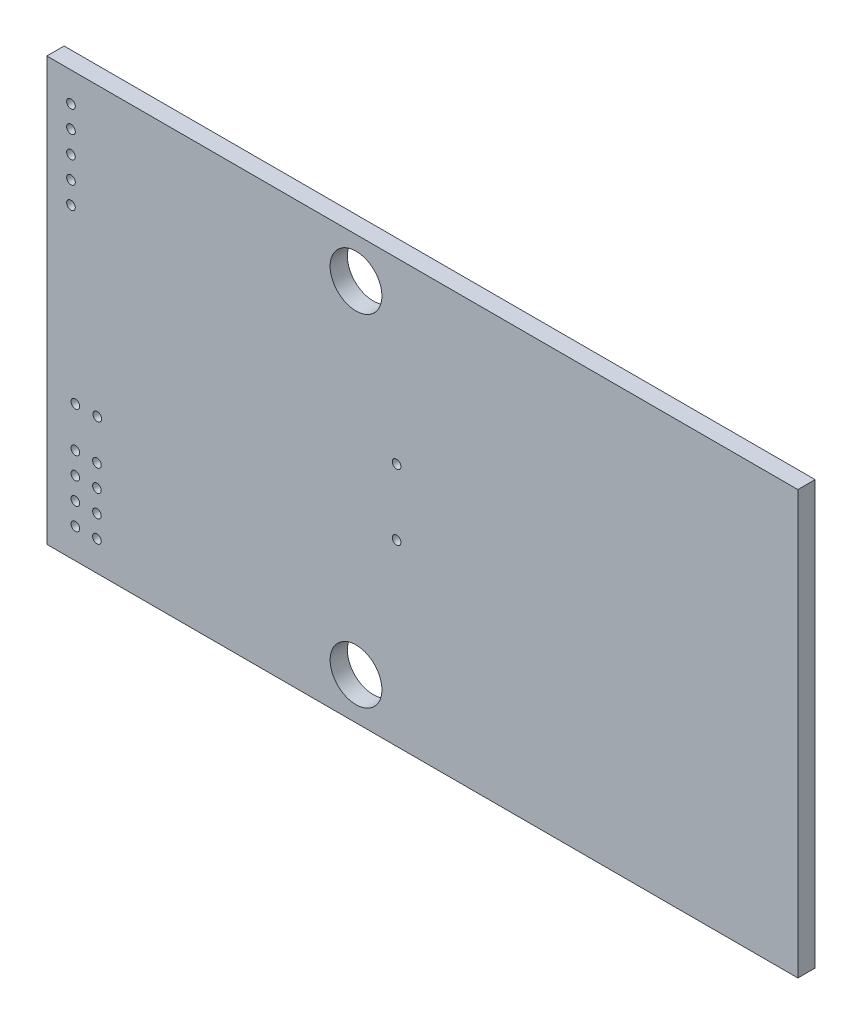
ISO-10303-21;
HEADER;
FILE_DESCRIPTION(('STEP AP214'),'2;1');
FILE_NAME('part.step','',(''),(''),'','','');
FILE_SCHEMA(('AUTOMOTIVE_DESIGN { 1 0 10303 214 1 1 1 1 }'));
ENDSEC;
DATA;
#1=APPLICATION_CONTEXT('core data for automotive mechanical design processes');
#2=APPLICATION_PROTOCOL_DEFINITION('international standard','automotive_design',2000,#1);
#3=PRODUCT_CONTEXT('',#1,'mechanical');
#4=PRODUCT('Part','Part','',(#3));
#5=PRODUCT_RELATED_PRODUCT_CATEGORY('part','',(#4));
#6=PRODUCT_DEFINITION_FORMATION('','',#4);
#7=PRODUCT_DEFINITION_CONTEXT('part definition',#1,'design');
#8=PRODUCT_DEFINITION('design','',#6,#7);
#9=PRODUCT_DEFINITION_SHAPE('','',#8);
#10=(LENGTH_UNIT() NAMED_UNIT(*) SI_UNIT(.MILLI.,.METRE.));
#11=(NAMED_UNIT(*) PLANE_ANGLE_UNIT() SI_UNIT($,.RADIAN.));
#12=(NAMED_UNIT(*) SI_UNIT($,.STERADIAN.) SOLID_ANGLE_UNIT());
#13=UNCERTAINTY_MEASURE_WITH_UNIT(LENGTH_MEASURE(1.E-05),#10,'distance_accuracy_value','');
#14=(GEOMETRIC_REPRESENTATION_CONTEXT(3) GLOBAL_UNCERTAINTY_ASSIGNED_CONTEXT((#13)) GLOBAL_UNIT_ASSIGNED_CONTEXT((#10,
#11,#12)) REPRESENTATION_CONTEXT('',''));
#15=CARTESIAN_POINT('',(0.,0.,0.));
#16=DIRECTION('',(0.,0.,1.));
#17=DIRECTION('',(1.,0.,0.));
#18=AXIS2_PLACEMENT_3D('',#15,#16,#17);
#19=CARTESIAN_POINT('',(0.,0.,0.));
#20=DIRECTION('',(0.,1.,0.));
#21=DIRECTION('',(1.,0.,0.));
#22=AXIS2_PLACEMENT_3D('',#19,#20,#21);
#23=PLANE('',#22);
#24=DIRECTION('',(1.,0.,0.));
#25=VECTOR('',#24,1.);
#26=CARTESIAN_POINT('',(0.,0.,2.0012787));
#27=LINE('',#26,#25);
#28=CARTESIAN_POINT('',(0.,0.,2.0012787));
#29=VERTEX_POINT('',#28);
#30=CARTESIAN_POINT('',(87.,0.,2.0012787));
#31=VERTEX_POINT('',#30);
#32=EDGE_CURVE('E11',#29,#31,#27,.T.);
#33=ORIENTED_EDGE('',*,*,#32,.F.);
#34=DIRECTION('',(0.,0.,1.));
#35=VECTOR('',#34,1.);
#36=CARTESIAN_POINT('',(0.,0.,0.));
#37=LINE('',#36,#35);
#38=CARTESIAN_POINT('',(0.,0.,0.));
#39=VERTEX_POINT('',#38);
#40=EDGE_CURVE('E24',#39,#29,#37,.T.);
#41=ORIENTED_EDGE('',*,*,#40,.F.);
#42=DIRECTION('',(1.,0.,0.));
#43=VECTOR('',#42,1.);
#44=CARTESIAN_POINT('',(0.,0.,0.));
#45=LINE('',#44,#43);
#46=CARTESIAN_POINT('',(87.,0.,0.));
#47=VERTEX_POINT('',#46);
#48=EDGE_CURVE('E348',#39,#47,#45,.T.);
#49=ORIENTED_EDGE('',*,*,#48,.T.);
#50=DIRECTION('',(0.,0.,1.));
#51=VECTOR('',#50,1.);
#52=CARTESIAN_POINT('',(87.,0.,0.));
#53=LINE('',#52,#51);
#54=EDGE_CURVE('E37',#47,#31,#53,.T.);
#55=ORIENTED_EDGE('',*,*,#54,.T.);
#56=EDGE_LOOP('',(#33,#41,#49,#55));
#57=FACE_BOUND('',#56,.T.);
#58=ADVANCED_FACE('F17',(#57),#23,.F.);
#59=CARTESIAN_POINT('',(87.,0.,0.));
#60=DIRECTION('',(-1.,0.,0.));
#61=DIRECTION('',(0.,1.,0.));
#62=AXIS2_PLACEMENT_3D('',#59,#60,#61);
#63=PLANE('',#62);
#64=DIRECTION('',(0.,1.,0.));
#65=VECTOR('',#64,1.);
#66=CARTESIAN_POINT('',(87.,0.,2.0012787));
#67=LINE('',#66,#65);
#68=CARTESIAN_POINT('',(87.,49.,2.0012787));
#69=VERTEX_POINT('',#68);
#70=EDGE_CURVE('E344',#31,#69,#67,.T.);
#71=ORIENTED_EDGE('',*,*,#70,.F.);
#72=ORIENTED_EDGE('',*,*,#54,.F.);
#73=DIRECTION('',(0.,1.,0.));
#74=VECTOR('',#73,1.);
#75=CARTESIAN_POINT('',(87.,0.,0.));
#76=LINE('',#75,#74);
#77=CARTESIAN_POINT('',(87.,49.,0.));
#78=VERTEX_POINT('',#77);
#79=EDGE_CURVE('E341',#47,#78,#76,.T.);
#80=ORIENTED_EDGE('',*,*,#79,.T.);
#81=DIRECTION('',(0.,0.,1.));
#82=VECTOR('',#81,1.);
#83=CARTESIAN_POINT('',(87.,49.,0.));
#84=LINE('',#83,#82);
#85=EDGE_CURVE('E339',#78,#69,#84,.T.);
#86=ORIENTED_EDGE('',*,*,#85,.T.);
#87=EDGE_LOOP('',(#71,#72,#80,#86));
#88=FACE_BOUND('',#87,.T.);
#89=ADVANCED_FACE('F357',(#88),#63,.F.);
#90=CARTESIAN_POINT('',(87.,49.,0.));
#91=DIRECTION('',(0.,-1.,0.));
#92=DIRECTION('',(-1.,0.,0.));
#93=AXIS2_PLACEMENT_3D('',#90,#91,#92);
#94=PLANE('',#93);
#95=DIRECTION('',(-1.,0.,0.));
#96=VECTOR('',#95,1.);
#97=CARTESIAN_POINT('',(87.,49.,2.0012787));
#98=LINE('',#97,#96);
#99=CARTESIAN_POINT('',(0.,49.,2.0012787));
#100=VERTEX_POINT('',#99);
#101=EDGE_CURVE('E336',#69,#100,#98,.T.);
#102=ORIENTED_EDGE('',*,*,#101,.F.);
#103=ORIENTED_EDGE('',*,*,#85,.F.);
#104=DIRECTION('',(-1.,0.,0.));
#105=VECTOR('',#104,1.);
#106=CARTESIAN_POINT('',(87.,49.,0.));
#107=LINE('',#106,#105);
#108=CARTESIAN_POINT('',(0.,49.,0.));
#109=VERTEX_POINT('',#108);
#110=EDGE_CURVE('E333',#78,#109,#107,.T.);
#111=ORIENTED_EDGE('',*,*,#110,.T.);
#112=DIRECTION('',(0.,0.,1.));
#113=VECTOR('',#112,1.);
#114=CARTESIAN_POINT('',(0.,49.,0.));
#115=LINE('',#114,#113);
#116=EDGE_CURVE('E331',#109,#100,#115,.T.);
#117=ORIENTED_EDGE('',*,*,#116,.T.);
#118=EDGE_LOOP('',(#102,#103,#111,#117));
#119=FACE_BOUND('',#118,.T.);
#120=ADVANCED_FACE('F363',(#119),#94,.F.);
#121=CARTESIAN_POINT('',(0.,49.,0.));
#122=DIRECTION('',(1.,0.,0.));
#123=DIRECTION('',(0.,-1.,0.));
#124=AXIS2_PLACEMENT_3D('',#121,#122,#123);
#125=PLANE('',#124);
#126=DIRECTION('',(0.,-1.,0.));
#127=VECTOR('',#126,1.);
#128=CARTESIAN_POINT('',(0.,49.,2.0012787));
#129=LINE('',#128,#127);
#130=EDGE_CURVE('E328',#100,#29,#129,.T.);
#131=ORIENTED_EDGE('',*,*,#130,.F.);
#132=ORIENTED_EDGE('',*,*,#116,.F.);
#133=DIRECTION('',(0.,-1.,0.));
#134=VECTOR('',#133,1.);
#135=CARTESIAN_POINT('',(0.,49.,0.));
#136=LINE('',#135,#134);
#137=EDGE_CURVE('E326',#109,#39,#136,.T.);
#138=ORIENTED_EDGE('',*,*,#137,.T.);
#139=ORIENTED_EDGE('',*,*,#40,.T.);
#140=EDGE_LOOP('',(#131,#132,#138,#139));
#141=FACE_BOUND('',#140,.T.);
#142=ADVANCED_FACE('F364',(#141),#125,.F.);
#143=CARTESIAN_POINT('',(3.302,11.08600018,0.));
#144=DIRECTION('',(0.,0.,-1.));
#145=DIRECTION('',(1.,0.,0.));
#146=AXIS2_PLACEMENT_3D('',#143,#144,#145);
#147=CYLINDRICAL_SURFACE('',#146,0.499999);
#148=DIRECTION('',(0.,0.,1.));
#149=VECTOR('',#148,1.);
#150=CARTESIAN_POINT('',(3.801999,11.08600018,0.));
#151=LINE('',#150,#149);
#152=CARTESIAN_POINT('',(3.801999,11.08600018,0.));
#153=VERTEX_POINT('',#152);
#154=CARTESIAN_POINT('',(3.801999,11.08600018,2.0012787));
#155=VERTEX_POINT('',#154);
#156=EDGE_CURVE('E324',#153,#155,#151,.T.);
#157=ORIENTED_EDGE('',*,*,#156,.T.);
#158=CARTESIAN_POINT('',(3.302,11.08600018,2.0012787));
#159=DIRECTION('',(0.,0.,1.));
#160=DIRECTION('',(1.,0.,0.));
#161=AXIS2_PLACEMENT_3D('',#158,#159,#160);
#162=CIRCLE('',#161,0.499999);
#163=EDGE_CURVE('E321',#155,#155,#162,.T.);
#164=ORIENTED_EDGE('',*,*,#163,.T.);
#165=ORIENTED_EDGE('',*,*,#156,.F.);
#166=CARTESIAN_POINT('',(3.302,11.08600018,0.));
#167=DIRECTION('',(0.,0.,1.));
#168=DIRECTION('',(1.,0.,0.));
#169=AXIS2_PLACEMENT_3D('',#166,#167,#168);
#170=CIRCLE('',#169,0.499999);
#171=EDGE_CURVE('E318',#153,#153,#170,.T.);
#172=ORIENTED_EDGE('',*,*,#171,.F.);
#173=EDGE_LOOP('',(#157,#164,#165,#172));
#174=FACE_BOUND('',#173,.T.);
#175=ADVANCED_FACE('F366',(#174),#147,.F.);
#176=CARTESIAN_POINT('',(3.302,15.748,0.));
#177=DIRECTION('',(0.,0.,-1.));
#178=DIRECTION('',(1.,0.,0.));
#179=AXIS2_PLACEMENT_3D('',#176,#177,#178);
#180=CYLINDRICAL_SURFACE('',#179,0.499999);
#181=DIRECTION('',(0.,0.,1.));
#182=VECTOR('',#181,1.);
#183=CARTESIAN_POINT('',(3.801999,15.748,0.));
#184=LINE('',#183,#182);
#185=CARTESIAN_POINT('',(3.801999,15.748,0.));
#186=VERTEX_POINT('',#185);
#187=CARTESIAN_POINT('',(3.801999,15.748,2.0012787));
#188=VERTEX_POINT('',#187);
#189=EDGE_CURVE('E316',#186,#188,#184,.T.);
#190=ORIENTED_EDGE('',*,*,#189,.T.);
#191=CARTESIAN_POINT('',(3.302,15.748,2.0012787));
#192=DIRECTION('',(0.,0.,1.));
#193=DIRECTION('',(1.,0.,0.));
#194=AXIS2_PLACEMENT_3D('',#191,#192,#193);
#195=CIRCLE('',#194,0.499999);
#196=EDGE_CURVE('E313',#188,#188,#195,.T.);
#197=ORIENTED_EDGE('',*,*,#196,.T.);
#198=ORIENTED_EDGE('',*,*,#189,.F.);
#199=CARTESIAN_POINT('',(3.302,15.748,0.));
#200=DIRECTION('',(0.,0.,1.));
#201=DIRECTION('',(1.,0.,0.));
#202=AXIS2_PLACEMENT_3D('',#199,#200,#201);
#203=CIRCLE('',#202,0.499999);
#204=EDGE_CURVE('E310',#186,#186,#203,.T.);
#205=ORIENTED_EDGE('',*,*,#204,.F.);
#206=EDGE_LOOP('',(#190,#197,#198,#205));
#207=FACE_BOUND('',#206,.T.);
#208=ADVANCED_FACE('F373',(#207),#180,.F.);
#209=CARTESIAN_POINT('',(3.302,3.46600018,0.));
#210=DIRECTION('',(0.,0.,-1.));
#211=DIRECTION('',(1.,0.,0.));
#212=AXIS2_PLACEMENT_3D('',#209,#210,#211);
#213=CYLINDRICAL_SURFACE('',#212,0.499999);
#214=DIRECTION('',(0.,0.,1.));
#215=VECTOR('',#214,1.);
#216=CARTESIAN_POINT('',(3.801999,3.46600018,0.));
#217=LINE('',#216,#215);
#218=CARTESIAN_POINT('',(3.801999,3.46600018,0.));
#219=VERTEX_POINT('',#218);
#220=CARTESIAN_POINT('',(3.801999,3.46600018,2.0012787));
#221=VERTEX_POINT('',#220);
#222=EDGE_CURVE('E308',#219,#221,#217,.T.);
#223=ORIENTED_EDGE('',*,*,#222,.T.);
#224=CARTESIAN_POINT('',(3.302,3.46600018,2.0012787));
#225=DIRECTION('',(0.,0.,1.));
#226=DIRECTION('',(1.,0.,0.));
#227=AXIS2_PLACEMENT_3D('',#224,#225,#226);
#228=CIRCLE('',#227,0.499999);
#229=EDGE_CURVE('E305',#221,#221,#228,.T.);
#230=ORIENTED_EDGE('',*,*,#229,.T.);
#231=ORIENTED_EDGE('',*,*,#222,.F.);
#232=CARTESIAN_POINT('',(3.302,3.46600018,0.));
#233=DIRECTION('',(0.,0.,1.));
#234=DIRECTION('',(1.,0.,0.));
#235=AXIS2_PLACEMENT_3D('',#232,#233,#234);
#236=CIRCLE('',#235,0.499999);
#237=EDGE_CURVE('E302',#219,#219,#236,.T.);
#238=ORIENTED_EDGE('',*,*,#237,.F.);
#239=EDGE_LOOP('',(#223,#230,#231,#238));
#240=FACE_BOUND('',#239,.T.);
#241=ADVANCED_FACE('F414',(#240),#213,.F.);
#242=CARTESIAN_POINT('',(3.302,8.54600018,0.));
#243=DIRECTION('',(0.,0.,-1.));
#244=DIRECTION('',(1.,0.,0.));
#245=AXIS2_PLACEMENT_3D('',#242,#243,#244);
#246=CYLINDRICAL_SURFACE('',#245,0.499999);
#247=DIRECTION('',(0.,0.,1.));
#248=VECTOR('',#247,1.);
#249=CARTESIAN_POINT('',(3.801999,8.54600018,0.));
#250=LINE('',#249,#248);
#251=CARTESIAN_POINT('',(3.801999,8.54600018,0.));
#252=VERTEX_POINT('',#251);
#253=CARTESIAN_POINT('',(3.801999,8.54600018,2.0012787));
#254=VERTEX_POINT('',#253);
#255=EDGE_CURVE('E300',#252,#254,#250,.T.);
#256=ORIENTED_EDGE('',*,*,#255,.T.);
#257=CARTESIAN_POINT('',(3.302,8.54600018,2.0012787));
#258=DIRECTION('',(0.,0.,1.));
#259=DIRECTION('',(1.,0.,0.));
#260=AXIS2_PLACEMENT_3D('',#257,#258,#259);
#261=CIRCLE('',#260,0.499999);
#262=EDGE_CURVE('E297',#254,#254,#261,.T.);
#263=ORIENTED_EDGE('',*,*,#262,.T.);
#264=ORIENTED_EDGE('',*,*,#255,.F.);
#265=CARTESIAN_POINT('',(3.302,8.54600018,0.));
#266=DIRECTION('',(0.,0.,1.));
#267=DIRECTION('',(1.,0.,0.));
#268=AXIS2_PLACEMENT_3D('',#265,#266,#267);
#269=CIRCLE('',#268,0.499999);
#270=EDGE_CURVE('E294',#252,#252,#269,.T.);
#271=ORIENTED_EDGE('',*,*,#270,.F.);
#272=EDGE_LOOP('',(#256,#263,#264,#271));
#273=FACE_BOUND('',#272,.T.);
#274=ADVANCED_FACE('F424',(#273),#246,.F.);
#275=CARTESIAN_POINT('',(2.794,43.053,0.));
#276=DIRECTION('',(0.,0.,-1.));
#277=DIRECTION('',(1.,0.,0.));
#278=AXIS2_PLACEMENT_3D('',#275,#276,#277);
#279=CYLINDRICAL_SURFACE('',#278,0.499999);
#280=DIRECTION('',(0.,0.,1.));
#281=VECTOR('',#280,1.);
#282=CARTESIAN_POINT('',(3.293999,43.053,0.));
#283=LINE('',#282,#281);
#284=CARTESIAN_POINT('',(3.293999,43.053,0.));
#285=VERTEX_POINT('',#284);
#286=CARTESIAN_POINT('',(3.293999,43.053,2.0012787));
#287=VERTEX_POINT('',#286);
#288=EDGE_CURVE('E292',#285,#287,#283,.T.);
#289=ORIENTED_EDGE('',*,*,#288,.T.);
#290=CARTESIAN_POINT('',(2.794,43.053,2.0012787));
#291=DIRECTION('',(0.,0.,1.));
#292=DIRECTION('',(1.,0.,0.));
#293=AXIS2_PLACEMENT_3D('',#290,#291,#292);
#294=CIRCLE('',#293,0.499999);
#295=EDGE_CURVE('E289',#287,#287,#294,.T.);
#296=ORIENTED_EDGE('',*,*,#295,.T.);
#297=ORIENTED_EDGE('',*,*,#288,.F.);
#298=CARTESIAN_POINT('',(2.794,43.053,0.));
#299=DIRECTION('',(0.,0.,1.));
#300=DIRECTION('',(1.,0.,0.));
#301=AXIS2_PLACEMENT_3D('',#298,#299,#300);
#302=CIRCLE('',#301,0.499999);
#303=EDGE_CURVE('E286',#285,#285,#302,.T.);
#304=ORIENTED_EDGE('',*,*,#303,.F.);
#305=EDGE_LOOP('',(#289,#296,#297,#304));
#306=FACE_BOUND('',#305,.T.);
#307=ADVANCED_FACE('F434',(#306),#279,.F.);
#308=CARTESIAN_POINT('',(2.794,45.593,0.));
#309=DIRECTION('',(0.,0.,-1.));
#310=DIRECTION('',(1.,0.,0.));
#311=AXIS2_PLACEMENT_3D('',#308,#309,#310);
#312=CYLINDRICAL_SURFACE('',#311,0.499999);
#313=DIRECTION('',(0.,0.,1.));
#314=VECTOR('',#313,1.);
#315=CARTESIAN_POINT('',(3.293999,45.593,0.));
#316=LINE('',#315,#314);
#317=CARTESIAN_POINT('',(3.293999,45.593,0.));
#318=VERTEX_POINT('',#317);
#319=CARTESIAN_POINT('',(3.293999,45.593,2.0012787));
#320=VERTEX_POINT('',#319);
#321=EDGE_CURVE('E284',#318,#320,#316,.T.);
#322=ORIENTED_EDGE('',*,*,#321,.T.);
#323=CARTESIAN_POINT('',(2.794,45.593,2.0012787));
#324=DIRECTION('',(0.,0.,1.));
#325=DIRECTION('',(1.,0.,0.));
#326=AXIS2_PLACEMENT_3D('',#323,#324,#325);
#327=CIRCLE('',#326,0.499999);
#328=EDGE_CURVE('E281',#320,#320,#327,.T.);
#329=ORIENTED_EDGE('',*,*,#328,.T.);
#330=ORIENTED_EDGE('',*,*,#321,.F.);
#331=CARTESIAN_POINT('',(2.794,45.593,0.));
#332=DIRECTION('',(0.,0.,1.));
#333=DIRECTION('',(1.,0.,0.));
#334=AXIS2_PLACEMENT_3D('',#331,#332,#333);
#335=CIRCLE('',#334,0.499999);
#336=EDGE_CURVE('E278',#318,#318,#335,.T.);
#337=ORIENTED_EDGE('',*,*,#336,.F.);
#338=EDGE_LOOP('',(#322,#329,#330,#337));
#339=FACE_BOUND('',#338,.T.);
#340=ADVANCED_FACE('F444',(#339),#312,.F.);
#341=CARTESIAN_POINT('',(2.794,35.433,0.));
#342=DIRECTION('',(0.,0.,-1.));
#343=DIRECTION('',(1.,0.,0.));
#344=AXIS2_PLACEMENT_3D('',#341,#342,#343);
#345=CYLINDRICAL_SURFACE('',#344,0.499999);
#346=DIRECTION('',(0.,0.,1.));
#347=VECTOR('',#346,1.);
#348=CARTESIAN_POINT('',(3.293999,35.433,0.));
#349=LINE('',#348,#347);
#350=CARTESIAN_POINT('',(3.293999,35.433,0.));
#351=VERTEX_POINT('',#350);
#352=CARTESIAN_POINT('',(3.293999,35.433,2.0012787));
#353=VERTEX_POINT('',#352);
#354=EDGE_CURVE('E276',#351,#353,#349,.T.);
#355=ORIENTED_EDGE('',*,*,#354,.T.);
#356=CARTESIAN_POINT('',(2.794,35.433,2.0012787));
#357=DIRECTION('',(0.,0.,1.));
#358=DIRECTION('',(1.,0.,0.));
#359=AXIS2_PLACEMENT_3D('',#356,#357,#358);
#360=CIRCLE('',#359,0.499999);
#361=EDGE_CURVE('E273',#353,#353,#360,.T.);
#362=ORIENTED_EDGE('',*,*,#361,.T.);
#363=ORIENTED_EDGE('',*,*,#354,.F.);
#364=CARTESIAN_POINT('',(2.794,35.433,0.));
#365=DIRECTION('',(0.,0.,1.));
#366=DIRECTION('',(1.,0.,0.));
#367=AXIS2_PLACEMENT_3D('',#364,#365,#366);
#368=CIRCLE('',#367,0.499999);
#369=EDGE_CURVE('E270',#351,#351,#368,.T.);
#370=ORIENTED_EDGE('',*,*,#369,.F.);
#371=EDGE_LOOP('',(#355,#362,#363,#370));
#372=FACE_BOUND('',#371,.T.);
#373=ADVANCED_FACE('F454',(#372),#345,.F.);
#374=CARTESIAN_POINT('',(2.794,40.513,0.));
#375=DIRECTION('',(0.,0.,-1.));
#376=DIRECTION('',(1.,0.,0.));
#377=AXIS2_PLACEMENT_3D('',#374,#375,#376);
#378=CYLINDRICAL_SURFACE('',#377,0.499999);
#379=DIRECTION('',(0.,0.,1.));
#380=VECTOR('',#379,1.);
#381=CARTESIAN_POINT('',(3.293999,40.513,0.));
#382=LINE('',#381,#380);
#383=CARTESIAN_POINT('',(3.293999,40.513,0.));
#384=VERTEX_POINT('',#383);
#385=CARTESIAN_POINT('',(3.293999,40.513,2.0012787));
#386=VERTEX_POINT('',#385);
#387=EDGE_CURVE('E268',#384,#386,#382,.T.);
#388=ORIENTED_EDGE('',*,*,#387,.T.);
#389=CARTESIAN_POINT('',(2.794,40.513,2.0012787));
#390=DIRECTION('',(0.,0.,1.));
#391=DIRECTION('',(1.,0.,0.));
#392=AXIS2_PLACEMENT_3D('',#389,#390,#391);
#393=CIRCLE('',#392,0.499999);
#394=EDGE_CURVE('E265',#386,#386,#393,.T.);
#395=ORIENTED_EDGE('',*,*,#394,.T.);
#396=ORIENTED_EDGE('',*,*,#387,.F.);
#397=CARTESIAN_POINT('',(2.794,40.513,0.));
#398=DIRECTION('',(0.,0.,1.));
#399=DIRECTION('',(1.,0.,0.));
#400=AXIS2_PLACEMENT_3D('',#397,#398,#399);
#401=CIRCLE('',#400,0.499999);
#402=EDGE_CURVE('E262',#384,#384,#401,.T.);
#403=ORIENTED_EDGE('',*,*,#402,.F.);
#404=EDGE_LOOP('',(#388,#395,#396,#403));
#405=FACE_BOUND('',#404,.T.);
#406=ADVANCED_FACE('F464',(#405),#378,.F.);
#407=CARTESIAN_POINT('',(2.794,37.973,0.));
#408=DIRECTION('',(0.,0.,-1.));
#409=DIRECTION('',(1.,0.,0.));
#410=AXIS2_PLACEMENT_3D('',#407,#408,#409);
#411=CYLINDRICAL_SURFACE('',#410,0.499999);
#412=DIRECTION('',(0.,0.,1.));
#413=VECTOR('',#412,1.);
#414=CARTESIAN_POINT('',(3.293999,37.973,0.));
#415=LINE('',#414,#413);
#416=CARTESIAN_POINT('',(3.293999,37.973,0.));
#417=VERTEX_POINT('',#416);
#418=CARTESIAN_POINT('',(3.293999,37.973,2.0012787));
#419=VERTEX_POINT('',#418);
#420=EDGE_CURVE('E260',#417,#419,#415,.T.);
#421=ORIENTED_EDGE('',*,*,#420,.T.);
#422=CARTESIAN_POINT('',(2.794,37.973,2.0012787));
#423=DIRECTION('',(0.,0.,1.));
#424=DIRECTION('',(1.,0.,0.));
#425=AXIS2_PLACEMENT_3D('',#422,#423,#424);
#426=CIRCLE('',#425,0.499999);
#427=EDGE_CURVE('E257',#419,#419,#426,.T.);
#428=ORIENTED_EDGE('',*,*,#427,.T.);
#429=ORIENTED_EDGE('',*,*,#420,.F.);
#430=CARTESIAN_POINT('',(2.794,37.973,0.));
#431=DIRECTION('',(0.,0.,1.));
#432=DIRECTION('',(1.,0.,0.));
#433=AXIS2_PLACEMENT_3D('',#430,#431,#432);
#434=CIRCLE('',#433,0.499999);
#435=EDGE_CURVE('E254',#417,#417,#434,.T.);
#436=ORIENTED_EDGE('',*,*,#435,.F.);
#437=EDGE_LOOP('',(#421,#428,#429,#436));
#438=FACE_BOUND('',#437,.T.);
#439=ADVANCED_FACE('F474',(#438),#411,.F.);
#440=CARTESIAN_POINT('',(5.80200008,3.46600018,0.));
#441=DIRECTION('',(0.,0.,-1.));
#442=DIRECTION('',(1.,0.,0.));
#443=AXIS2_PLACEMENT_3D('',#440,#441,#442);
#444=CYLINDRICAL_SURFACE('',#443,0.499999);
#445=DIRECTION('',(0.,0.,1.));
#446=VECTOR('',#445,1.);
#447=CARTESIAN_POINT('',(6.30199908,3.46600018,0.));
#448=LINE('',#447,#446);
#449=CARTESIAN_POINT('',(6.30199908,3.46600018,0.));
#450=VERTEX_POINT('',#449);
#451=CARTESIAN_POINT('',(6.30199908,3.46600018,2.0012787));
#452=VERTEX_POINT('',#451);
#453=EDGE_CURVE('E252',#450,#452,#448,.T.);
#454=ORIENTED_EDGE('',*,*,#453,.T.);
#455=CARTESIAN_POINT('',(5.80200008,3.46600018,2.0012787));
#456=DIRECTION('',(0.,0.,1.));
#457=DIRECTION('',(1.,0.,0.));
#458=AXIS2_PLACEMENT_3D('',#455,#456,#457);
#459=CIRCLE('',#458,0.499999);
#460=EDGE_CURVE('E249',#452,#452,#459,.T.);
#461=ORIENTED_EDGE('',*,*,#460,.T.);
#462=ORIENTED_EDGE('',*,*,#453,.F.);
#463=CARTESIAN_POINT('',(5.80200008,3.46600018,0.));
#464=DIRECTION('',(0.,0.,1.));
#465=DIRECTION('',(1.,0.,0.));
#466=AXIS2_PLACEMENT_3D('',#463,#464,#465);
#467=CIRCLE('',#466,0.499999);
#468=EDGE_CURVE('E246',#450,#450,#467,.T.);
#469=ORIENTED_EDGE('',*,*,#468,.F.);
#470=EDGE_LOOP('',(#454,#461,#462,#469));
#471=FACE_BOUND('',#470,.T.);
#472=ADVANCED_FACE('F484',(#471),#444,.F.);
#473=CARTESIAN_POINT('',(3.302,6.00600018,0.));
#474=DIRECTION('',(0.,0.,-1.));
#475=DIRECTION('',(1.,0.,0.));
#476=AXIS2_PLACEMENT_3D('',#473,#474,#475);
#477=CYLINDRICAL_SURFACE('',#476,0.499999);
#478=DIRECTION('',(0.,0.,1.));
#479=VECTOR('',#478,1.);
#480=CARTESIAN_POINT('',(3.801999,6.00600018,0.));
#481=LINE('',#480,#479);
#482=CARTESIAN_POINT('',(3.801999,6.00600018,0.));
#483=VERTEX_POINT('',#482);
#484=CARTESIAN_POINT('',(3.801999,6.00600018,2.0012787));
#485=VERTEX_POINT('',#484);
#486=EDGE_CURVE('E244',#483,#485,#481,.T.);
#487=ORIENTED_EDGE('',*,*,#486,.T.);
#488=CARTESIAN_POINT('',(3.302,6.00600018,2.0012787));
#489=DIRECTION('',(0.,0.,1.));
#490=DIRECTION('',(1.,0.,0.));
#491=AXIS2_PLACEMENT_3D('',#488,#489,#490);
#492=CIRCLE('',#491,0.499999);
#493=EDGE_CURVE('E241',#485,#485,#492,.T.);
#494=ORIENTED_EDGE('',*,*,#493,.T.);
#495=ORIENTED_EDGE('',*,*,#486,.F.);
#496=CARTESIAN_POINT('',(3.302,6.00600018,0.));
#497=DIRECTION('',(0.,0.,1.));
#498=DIRECTION('',(1.,0.,0.));
#499=AXIS2_PLACEMENT_3D('',#496,#497,#498);
#500=CIRCLE('',#499,0.499999);
#501=EDGE_CURVE('E238',#483,#483,#500,.T.);
#502=ORIENTED_EDGE('',*,*,#501,.F.);
#503=EDGE_LOOP('',(#487,#494,#495,#502));
#504=FACE_BOUND('',#503,.T.);
#505=ADVANCED_FACE('F494',(#504),#477,.F.);
#506=CARTESIAN_POINT('',(5.80200008,6.00600018,0.));
#507=DIRECTION('',(0.,0.,-1.));
#508=DIRECTION('',(1.,0.,0.));
#509=AXIS2_PLACEMENT_3D('',#506,#507,#508);
#510=CYLINDRICAL_SURFACE('',#509,0.499999);
#511=DIRECTION('',(0.,0.,1.));
#512=VECTOR('',#511,1.);
#513=CARTESIAN_POINT('',(6.30199908,6.00600018,0.));
#514=LINE('',#513,#512);
#515=CARTESIAN_POINT('',(6.30199908,6.00600018,0.));
#516=VERTEX_POINT('',#515);
#517=CARTESIAN_POINT('',(6.30199908,6.00600018,2.0012787));
#518=VERTEX_POINT('',#517);
#519=EDGE_CURVE('E236',#516,#518,#514,.T.);
#520=ORIENTED_EDGE('',*,*,#519,.T.);
#521=CARTESIAN_POINT('',(5.80200008,6.00600018,2.0012787));
#522=DIRECTION('',(0.,0.,1.));
#523=DIRECTION('',(1.,0.,0.));
#524=AXIS2_PLACEMENT_3D('',#521,#522,#523);
#525=CIRCLE('',#524,0.499999);
#526=EDGE_CURVE('E233',#518,#518,#525,.T.);
#527=ORIENTED_EDGE('',*,*,#526,.T.);
#528=ORIENTED_EDGE('',*,*,#519,.F.);
#529=CARTESIAN_POINT('',(5.80200008,6.00600018,0.));
#530=DIRECTION('',(0.,0.,1.));
#531=DIRECTION('',(1.,0.,0.));
#532=AXIS2_PLACEMENT_3D('',#529,#530,#531);
#533=CIRCLE('',#532,0.499999);
#534=EDGE_CURVE('E230',#516,#516,#533,.T.);
#535=ORIENTED_EDGE('',*,*,#534,.F.);
#536=EDGE_LOOP('',(#520,#527,#528,#535));
#537=FACE_BOUND('',#536,.T.);
#538=ADVANCED_FACE('F504',(#537),#510,.F.);
#539=CARTESIAN_POINT('',(5.80200008,8.54600018,0.));
#540=DIRECTION('',(0.,0.,-1.));
#541=DIRECTION('',(1.,0.,0.));
#542=AXIS2_PLACEMENT_3D('',#539,#540,#541);
#543=CYLINDRICAL_SURFACE('',#542,0.499999);
#544=DIRECTION('',(0.,0.,1.));
#545=VECTOR('',#544,1.);
#546=CARTESIAN_POINT('',(6.30199908,8.54600018,0.));
#547=LINE('',#546,#545);
#548=CARTESIAN_POINT('',(6.30199908,8.54600018,0.));
#549=VERTEX_POINT('',#548);
#550=CARTESIAN_POINT('',(6.30199908,8.54600018,2.0012787));
#551=VERTEX_POINT('',#550);
#552=EDGE_CURVE('E228',#549,#551,#547,.T.);
#553=ORIENTED_EDGE('',*,*,#552,.T.);
#554=CARTESIAN_POINT('',(5.80200008,8.54600018,2.0012787));
#555=DIRECTION('',(0.,0.,1.));
#556=DIRECTION('',(1.,0.,0.));
#557=AXIS2_PLACEMENT_3D('',#554,#555,#556);
#558=CIRCLE('',#557,0.499999);
#559=EDGE_CURVE('E225',#551,#551,#558,.T.);
#560=ORIENTED_EDGE('',*,*,#559,.T.);
#561=ORIENTED_EDGE('',*,*,#552,.F.);
#562=CARTESIAN_POINT('',(5.80200008,8.54600018,0.));
#563=DIRECTION('',(0.,0.,1.));
#564=DIRECTION('',(1.,0.,0.));
#565=AXIS2_PLACEMENT_3D('',#562,#563,#564);
#566=CIRCLE('',#565,0.499999);
#567=EDGE_CURVE('E222',#549,#549,#566,.T.);
#568=ORIENTED_EDGE('',*,*,#567,.F.);
#569=EDGE_LOOP('',(#553,#560,#561,#568));
#570=FACE_BOUND('',#569,.T.);
#571=ADVANCED_FACE('F514',(#570),#543,.F.);
#572=CARTESIAN_POINT('',(35.814,4.826,0.));
#573=DIRECTION('',(0.,0.,-1.));
#574=DIRECTION('',(1.,0.,0.));
#575=AXIS2_PLACEMENT_3D('',#572,#573,#574);
#576=CYLINDRICAL_SURFACE('',#575,2.99999908);
#577=DIRECTION('',(0.,0.,1.));
#578=VECTOR('',#577,1.);
#579=CARTESIAN_POINT('',(38.81399908,4.826,0.));
#580=LINE('',#579,#578);
#581=CARTESIAN_POINT('',(38.81399908,4.826,0.));
#582=VERTEX_POINT('',#581);
#583=CARTESIAN_POINT('',(38.81399908,4.826,2.0012787));
#584=VERTEX_POINT('',#583);
#585=EDGE_CURVE('E220',#582,#584,#580,.T.);
#586=ORIENTED_EDGE('',*,*,#585,.T.);
#587=CARTESIAN_POINT('',(35.814,4.826,2.0012787));
#588=DIRECTION('',(0.,0.,1.));
#589=DIRECTION('',(1.,0.,0.));
#590=AXIS2_PLACEMENT_3D('',#587,#588,#589);
#591=CIRCLE('',#590,2.99999908);
#592=EDGE_CURVE('E217',#584,#584,#591,.T.);
#593=ORIENTED_EDGE('',*,*,#592,.T.);
#594=ORIENTED_EDGE('',*,*,#585,.F.);
#595=CARTESIAN_POINT('',(35.814,4.826,0.));
#596=DIRECTION('',(0.,0.,1.));
#597=DIRECTION('',(1.,0.,0.));
#598=AXIS2_PLACEMENT_3D('',#595,#596,#597);
#599=CIRCLE('',#598,2.99999908);
#600=EDGE_CURVE('E214',#582,#582,#599,.T.);
#601=ORIENTED_EDGE('',*,*,#600,.F.);
#602=EDGE_LOOP('',(#586,#593,#594,#601));
#603=FACE_BOUND('',#602,.T.);
#604=ADVANCED_FACE('F524',(#603),#576,.F.);
#605=CARTESIAN_POINT('',(5.80200008,11.08600018,0.));
#606=DIRECTION('',(0.,0.,-1.));
#607=DIRECTION('',(1.,0.,0.));
#608=AXIS2_PLACEMENT_3D('',#605,#606,#607);
#609=CYLINDRICAL_SURFACE('',#608,0.499999);
#610=DIRECTION('',(0.,0.,1.));
#611=VECTOR('',#610,1.);
#612=CARTESIAN_POINT('',(6.30199908,11.08600018,0.));
#613=LINE('',#612,#611);
#614=CARTESIAN_POINT('',(6.30199908,11.08600018,0.));
#615=VERTEX_POINT('',#614);
#616=CARTESIAN_POINT('',(6.30199908,11.08600018,2.0012787));
#617=VERTEX_POINT('',#616);
#618=EDGE_CURVE('E212',#615,#617,#613,.T.);
#619=ORIENTED_EDGE('',*,*,#618,.T.);
#620=CARTESIAN_POINT('',(5.80200008,11.08600018,2.0012787));
#621=DIRECTION('',(0.,0.,1.));
#622=DIRECTION('',(1.,0.,0.));
#623=AXIS2_PLACEMENT_3D('',#620,#621,#622);
#624=CIRCLE('',#623,0.499999);
#625=EDGE_CURVE('E209',#617,#617,#624,.T.);
#626=ORIENTED_EDGE('',*,*,#625,.T.);
#627=ORIENTED_EDGE('',*,*,#618,.F.);
#628=CARTESIAN_POINT('',(5.80200008,11.08600018,0.));
#629=DIRECTION('',(0.,0.,1.));
#630=DIRECTION('',(1.,0.,0.));
#631=AXIS2_PLACEMENT_3D('',#628,#629,#630);
#632=CIRCLE('',#631,0.499999);
#633=EDGE_CURVE('E206',#615,#615,#632,.T.);
#634=ORIENTED_EDGE('',*,*,#633,.F.);
#635=EDGE_LOOP('',(#619,#626,#627,#634));
#636=FACE_BOUND('',#635,.T.);
#637=ADVANCED_FACE('F534',(#636),#609,.F.);
#638=CARTESIAN_POINT('',(5.842,15.748,0.));
#639=DIRECTION('',(0.,0.,-1.));
#640=DIRECTION('',(1.,0.,0.));
#641=AXIS2_PLACEMENT_3D('',#638,#639,#640);
#642=CYLINDRICAL_SURFACE('',#641,0.499999);
#643=DIRECTION('',(0.,0.,1.));
#644=VECTOR('',#643,1.);
#645=CARTESIAN_POINT('',(6.341999,15.748,0.));
#646=LINE('',#645,#644);
#647=CARTESIAN_POINT('',(6.341999,15.748,0.));
#648=VERTEX_POINT('',#647);
#649=CARTESIAN_POINT('',(6.341999,15.748,2.0012787));
#650=VERTEX_POINT('',#649);
#651=EDGE_CURVE('E204',#648,#650,#646,.T.);
#652=ORIENTED_EDGE('',*,*,#651,.T.);
#653=CARTESIAN_POINT('',(5.842,15.748,2.0012787));
#654=DIRECTION('',(0.,0.,1.));
#655=DIRECTION('',(1.,0.,0.));
#656=AXIS2_PLACEMENT_3D('',#653,#654,#655);
#657=CIRCLE('',#656,0.499999);
#658=EDGE_CURVE('E201',#650,#650,#657,.T.);
#659=ORIENTED_EDGE('',*,*,#658,.T.);
#660=ORIENTED_EDGE('',*,*,#651,.F.);
#661=CARTESIAN_POINT('',(5.842,15.748,0.));
#662=DIRECTION('',(0.,0.,1.));
#663=DIRECTION('',(1.,0.,0.));
#664=AXIS2_PLACEMENT_3D('',#661,#662,#663);
#665=CIRCLE('',#664,0.499999);
#666=EDGE_CURVE('E198',#648,#648,#665,.T.);
#667=ORIENTED_EDGE('',*,*,#666,.F.);
#668=EDGE_LOOP('',(#652,#659,#660,#667));
#669=FACE_BOUND('',#668,.T.);
#670=ADVANCED_FACE('F544',(#669),#642,.F.);
#671=CARTESIAN_POINT('',(40.513,20.68999926,0.));
#672=DIRECTION('',(0.,0.,-1.));
#673=DIRECTION('',(1.,0.,0.));
#674=AXIS2_PLACEMENT_3D('',#671,#672,#673);
#675=CYLINDRICAL_SURFACE('',#674,0.499999);
#676=DIRECTION('',(0.,0.,1.));
#677=VECTOR('',#676,1.);
#678=CARTESIAN_POINT('',(41.012999,20.68999926,0.));
#679=LINE('',#678,#677);
#680=CARTESIAN_POINT('',(41.012999,20.68999926,0.));
#681=VERTEX_POINT('',#680);
#682=CARTESIAN_POINT('',(41.012999,20.68999926,2.0012787));
#683=VERTEX_POINT('',#682);
#684=EDGE_CURVE('E196',#681,#683,#679,.T.);
#685=ORIENTED_EDGE('',*,*,#684,.T.);
#686=CARTESIAN_POINT('',(40.513,20.68999926,2.0012787));
#687=DIRECTION('',(0.,0.,1.));
#688=DIRECTION('',(1.,0.,0.));
#689=AXIS2_PLACEMENT_3D('',#686,#687,#688);
#690=CIRCLE('',#689,0.499999);
#691=EDGE_CURVE('E193',#683,#683,#690,.T.);
#692=ORIENTED_EDGE('',*,*,#691,.T.);
#693=ORIENTED_EDGE('',*,*,#684,.F.);
#694=CARTESIAN_POINT('',(40.513,20.68999926,0.));
#695=DIRECTION('',(0.,0.,1.));
#696=DIRECTION('',(1.,0.,0.));
#697=AXIS2_PLACEMENT_3D('',#694,#695,#696);
#698=CIRCLE('',#697,0.499999);
#699=EDGE_CURVE('E190',#681,#681,#698,.T.);
#700=ORIENTED_EDGE('',*,*,#699,.F.);
#701=EDGE_LOOP('',(#685,#692,#693,#700));
#702=FACE_BOUND('',#701,.T.);
#703=ADVANCED_FACE('F554',(#702),#675,.F.);
#704=CARTESIAN_POINT('',(35.814,44.323,0.));
#705=DIRECTION('',(0.,0.,-1.));
#706=DIRECTION('',(1.,0.,0.));
#707=AXIS2_PLACEMENT_3D('',#704,#705,#706);
#708=CYLINDRICAL_SURFACE('',#707,2.99999908);
#709=DIRECTION('',(0.,0.,1.));
#710=VECTOR('',#709,1.);
#711=CARTESIAN_POINT('',(38.81399908,44.323,0.));
#712=LINE('',#711,#710);
#713=CARTESIAN_POINT('',(38.81399908,44.323,0.));
#714=VERTEX_POINT('',#713);
#715=CARTESIAN_POINT('',(38.81399908,44.323,2.0012787));
#716=VERTEX_POINT('',#715);
#717=EDGE_CURVE('E188',#714,#716,#712,.T.);
#718=ORIENTED_EDGE('',*,*,#717,.T.);
#719=CARTESIAN_POINT('',(35.814,44.323,2.0012787));
#720=DIRECTION('',(0.,0.,1.));
#721=DIRECTION('',(1.,0.,0.));
#722=AXIS2_PLACEMENT_3D('',#719,#720,#721);
#723=CIRCLE('',#722,2.99999908);
#724=EDGE_CURVE('E185',#716,#716,#723,.T.);
#725=ORIENTED_EDGE('',*,*,#724,.T.);
#726=ORIENTED_EDGE('',*,*,#717,.F.);
#727=CARTESIAN_POINT('',(35.814,44.323,0.));
#728=DIRECTION('',(0.,0.,1.));
#729=DIRECTION('',(1.,0.,0.));
#730=AXIS2_PLACEMENT_3D('',#727,#728,#729);
#731=CIRCLE('',#730,2.99999908);
#732=EDGE_CURVE('E176',#714,#714,#731,.T.);
#733=ORIENTED_EDGE('',*,*,#732,.F.);
#734=EDGE_LOOP('',(#718,#725,#726,#733));
#735=FACE_BOUND('',#734,.T.);
#736=ADVANCED_FACE('F564',(#735),#708,.F.);
#737=CARTESIAN_POINT('',(40.513,28.30999926,0.));
#738=DIRECTION('',(0.,0.,-1.));
#739=DIRECTION('',(1.,0.,0.));
#740=AXIS2_PLACEMENT_3D('',#737,#738,#739);
#741=CYLINDRICAL_SURFACE('',#740,0.499999);
#742=DIRECTION('',(0.,0.,1.));
#743=VECTOR('',#742,1.);
#744=CARTESIAN_POINT('',(41.012999,28.30999926,0.));
#745=LINE('',#744,#743);
#746=CARTESIAN_POINT('',(41.012999,28.30999926,0.));
#747=VERTEX_POINT('',#746);
#748=CARTESIAN_POINT('',(41.012999,28.30999926,2.0012787));
#749=VERTEX_POINT('',#748);
#750=EDGE_CURVE('E170',#747,#749,#745,.T.);
#751=ORIENTED_EDGE('',*,*,#750,.T.);
#752=CARTESIAN_POINT('',(40.513,28.30999926,2.0012787));
#753=DIRECTION('',(0.,0.,1.));
#754=DIRECTION('',(1.,0.,0.));
#755=AXIS2_PLACEMENT_3D('',#752,#753,#754);
#756=CIRCLE('',#755,0.499999);
#757=EDGE_CURVE('E175',#749,#749,#756,.T.);
#758=ORIENTED_EDGE('',*,*,#757,.T.);
#759=ORIENTED_EDGE('',*,*,#750,.F.);
#760=CARTESIAN_POINT('',(40.513,28.30999926,0.));
#761=DIRECTION('',(0.,0.,1.));
#762=DIRECTION('',(1.,0.,0.));
#763=AXIS2_PLACEMENT_3D('',#760,#761,#762);
#764=CIRCLE('',#763,0.499999);
#765=EDGE_CURVE('E173',#747,#747,#764,.T.);
#766=ORIENTED_EDGE('',*,*,#765,.F.);
#767=EDGE_LOOP('',(#751,#758,#759,#766));
#768=FACE_BOUND('',#767,.T.);
#769=ADVANCED_FACE('F172',(#768),#741,.F.);
#770=CARTESIAN_POINT('',(0.,0.,0.));
#771=DIRECTION('',(0.,0.,-1.));
#772=DIRECTION('',(-1.,0.,0.));
#773=AXIS2_PLACEMENT_3D('',#770,#771,#772);
#774=PLANE('',#773);
#775=ORIENTED_EDGE('',*,*,#137,.F.);
#776=ORIENTED_EDGE('',*,*,#110,.F.);
#777=ORIENTED_EDGE('',*,*,#79,.F.);
#778=ORIENTED_EDGE('',*,*,#48,.F.);
#779=EDGE_LOOP('',(#775,#776,#777,#778));
#780=FACE_BOUND('',#779,.T.);
#781=ORIENTED_EDGE('',*,*,#171,.T.);
#782=EDGE_LOOP('',(#781));
#783=FACE_BOUND('',#782,.T.);
#784=ORIENTED_EDGE('',*,*,#204,.T.);
#785=EDGE_LOOP('',(#784));
#786=FACE_BOUND('',#785,.T.);
#787=ORIENTED_EDGE('',*,*,#237,.T.);
#788=EDGE_LOOP('',(#787));
#789=FACE_BOUND('',#788,.T.);
#790=ORIENTED_EDGE('',*,*,#270,.T.);
#791=EDGE_LOOP('',(#790));
#792=FACE_BOUND('',#791,.T.);
#793=ORIENTED_EDGE('',*,*,#303,.T.);
#794=EDGE_LOOP('',(#793));
#795=FACE_BOUND('',#794,.T.);
#796=ORIENTED_EDGE('',*,*,#336,.T.);
#797=EDGE_LOOP('',(#796));
#798=FACE_BOUND('',#797,.T.);
#799=ORIENTED_EDGE('',*,*,#369,.T.);
#800=EDGE_LOOP('',(#799));
#801=FACE_BOUND('',#800,.T.);
#802=ORIENTED_EDGE('',*,*,#402,.T.);
#803=EDGE_LOOP('',(#802));
#804=FACE_BOUND('',#803,.T.);
#805=ORIENTED_EDGE('',*,*,#435,.T.);
#806=EDGE_LOOP('',(#805));
#807=FACE_BOUND('',#806,.T.);
#808=ORIENTED_EDGE('',*,*,#468,.T.);
#809=EDGE_LOOP('',(#808));
#810=FACE_BOUND('',#809,.T.);
#811=ORIENTED_EDGE('',*,*,#501,.T.);
#812=EDGE_LOOP('',(#811));
#813=FACE_BOUND('',#812,.T.);
#814=ORIENTED_EDGE('',*,*,#534,.T.);
#815=EDGE_LOOP('',(#814));
#816=FACE_BOUND('',#815,.T.);
#817=ORIENTED_EDGE('',*,*,#567,.T.);
#818=EDGE_LOOP('',(#817));
#819=FACE_BOUND('',#818,.T.);
#820=ORIENTED_EDGE('',*,*,#600,.T.);
#821=EDGE_LOOP('',(#820));
#822=FACE_BOUND('',#821,.T.);
#823=ORIENTED_EDGE('',*,*,#633,.T.);
#824=EDGE_LOOP('',(#823));
#825=FACE_BOUND('',#824,.T.);
#826=ORIENTED_EDGE('',*,*,#666,.T.);
#827=EDGE_LOOP('',(#826));
#828=FACE_BOUND('',#827,.T.);
#829=ORIENTED_EDGE('',*,*,#699,.T.);
#830=EDGE_LOOP('',(#829));
#831=FACE_BOUND('',#830,.T.);
#832=ORIENTED_EDGE('',*,*,#732,.T.);
#833=EDGE_LOOP('',(#832));
#834=FACE_BOUND('',#833,.T.);
#835=ORIENTED_EDGE('',*,*,#765,.T.);
#836=EDGE_LOOP('',(#835));
#837=FACE_BOUND('',#836,.T.);
#838=ADVANCED_FACE('F179',(#780,#783,#786,#789,#792,#795,#798,#801,#804,#807,#810,#813,#816,
#819,#822,#825,#828,#831,#834,#837),#774,.T.);
#839=CARTESIAN_POINT('',(0.,0.,2.0012787));
#840=DIRECTION('',(0.,0.,-1.));
#841=DIRECTION('',(-1.,0.,0.));
#842=AXIS2_PLACEMENT_3D('',#839,#840,#841);
#843=PLANE('',#842);
#844=ORIENTED_EDGE('',*,*,#32,.T.);
#845=ORIENTED_EDGE('',*,*,#70,.T.);
#846=ORIENTED_EDGE('',*,*,#101,.T.);
#847=ORIENTED_EDGE('',*,*,#130,.T.);
#848=EDGE_LOOP('',(#844,#845,#846,#847));
#849=FACE_BOUND('',#848,.T.);
#850=ORIENTED_EDGE('',*,*,#163,.F.);
#851=EDGE_LOOP('',(#850));
#852=FACE_BOUND('',#851,.T.);
#853=ORIENTED_EDGE('',*,*,#196,.F.);
#854=EDGE_LOOP('',(#853));
#855=FACE_BOUND('',#854,.T.);
#856=ORIENTED_EDGE('',*,*,#229,.F.);
#857=EDGE_LOOP('',(#856));
#858=FACE_BOUND('',#857,.T.);
#859=ORIENTED_EDGE('',*,*,#262,.F.);
#860=EDGE_LOOP('',(#859));
#861=FACE_BOUND('',#860,.T.);
#862=ORIENTED_EDGE('',*,*,#295,.F.);
#863=EDGE_LOOP('',(#862));
#864=FACE_BOUND('',#863,.T.);
#865=ORIENTED_EDGE('',*,*,#328,.F.);
#866=EDGE_LOOP('',(#865));
#867=FACE_BOUND('',#866,.T.);
#868=ORIENTED_EDGE('',*,*,#361,.F.);
#869=EDGE_LOOP('',(#868));
#870=FACE_BOUND('',#869,.T.);
#871=ORIENTED_EDGE('',*,*,#394,.F.);
#872=EDGE_LOOP('',(#871));
#873=FACE_BOUND('',#872,.T.);
#874=ORIENTED_EDGE('',*,*,#427,.F.);
#875=EDGE_LOOP('',(#874));
#876=FACE_BOUND('',#875,.T.);
#877=ORIENTED_EDGE('',*,*,#460,.F.);
#878=EDGE_LOOP('',(#877));
#879=FACE_BOUND('',#878,.T.);
#880=ORIENTED_EDGE('',*,*,#493,.F.);
#881=EDGE_LOOP('',(#880));
#882=FACE_BOUND('',#881,.T.);
#883=ORIENTED_EDGE('',*,*,#526,.F.);
#884=EDGE_LOOP('',(#883));
#885=FACE_BOUND('',#884,.T.);
#886=ORIENTED_EDGE('',*,*,#559,.F.);
#887=EDGE_LOOP('',(#886));
#888=FACE_BOUND('',#887,.T.);
#889=ORIENTED_EDGE('',*,*,#592,.F.);
#890=EDGE_LOOP('',(#889));
#891=FACE_BOUND('',#890,.T.);
#892=ORIENTED_EDGE('',*,*,#625,.F.);
#893=EDGE_LOOP('',(#892));
#894=FACE_BOUND('',#893,.T.);
#895=ORIENTED_EDGE('',*,*,#658,.F.);
#896=EDGE_LOOP('',(#895));
#897=FACE_BOUND('',#896,.T.);
#898=ORIENTED_EDGE('',*,*,#691,.F.);
#899=EDGE_LOOP('',(#898));
#900=FACE_BOUND('',#899,.T.);
#901=ORIENTED_EDGE('',*,*,#724,.F.);
#902=EDGE_LOOP('',(#901));
#903=FACE_BOUND('',#902,.T.);
#904=ORIENTED_EDGE('',*,*,#757,.F.);
#905=EDGE_LOOP('',(#904));
#906=FACE_BOUND('',#905,.T.);
#907=ADVANCED_FACE('F360',(#849,#852,#855,#858,#861,#864,#867,#870,#873,#876,#879,#882,#885,
#888,#891,#894,#897,#900,#903,#906),#843,.F.);
#908=CLOSED_SHELL('',(#58,#89,#120,#142,#175,#208,#241,#274,#307,#340,#373,#406,#439,#472,#505,
#538,#571,#604,#637,#670,#703,#736,#769,#838,#907));
#909=MANIFOLD_SOLID_BREP('B1',#908);
#910=ADVANCED_BREP_SHAPE_REPRESENTATION('',(#18,#909),#14);
#911=SHAPE_DEFINITION_REPRESENTATION(#9,#910);
ENDSEC;
END-ISO-10303-21;
